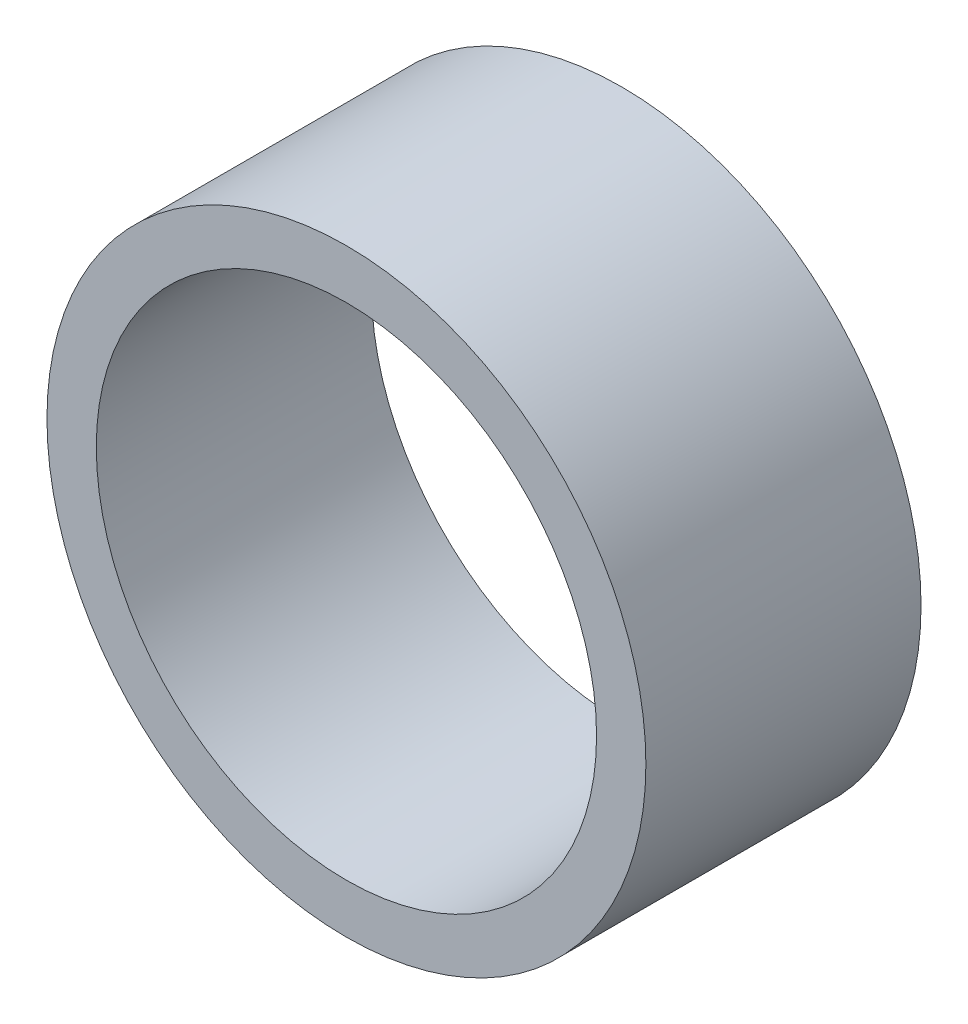
ISO-10303-21;
HEADER;
FILE_DESCRIPTION(('STEP AP214'),'2;1');
FILE_NAME('part.step','',(''),(''),'','','');
FILE_SCHEMA(('AUTOMOTIVE_DESIGN { 1 0 10303 214 1 1 1 1 }'));
ENDSEC;
DATA;
#1=APPLICATION_CONTEXT('core data for automotive mechanical design processes');
#2=APPLICATION_PROTOCOL_DEFINITION('international standard','automotive_design',2000,#1);
#3=PRODUCT_CONTEXT('',#1,'mechanical');
#4=PRODUCT('Part','Part','',(#3));
#5=PRODUCT_RELATED_PRODUCT_CATEGORY('part','',(#4));
#6=PRODUCT_DEFINITION_FORMATION('','',#4);
#7=PRODUCT_DEFINITION_CONTEXT('part definition',#1,'design');
#8=PRODUCT_DEFINITION('design','',#6,#7);
#9=PRODUCT_DEFINITION_SHAPE('','',#8);
#10=(LENGTH_UNIT() NAMED_UNIT(*) SI_UNIT(.MILLI.,.METRE.));
#11=(NAMED_UNIT(*) PLANE_ANGLE_UNIT() SI_UNIT($,.RADIAN.));
#12=(NAMED_UNIT(*) SI_UNIT($,.STERADIAN.) SOLID_ANGLE_UNIT());
#13=UNCERTAINTY_MEASURE_WITH_UNIT(LENGTH_MEASURE(1.E-05),#10,'distance_accuracy_value','');
#14=(GEOMETRIC_REPRESENTATION_CONTEXT(3) GLOBAL_UNCERTAINTY_ASSIGNED_CONTEXT((#13)) GLOBAL_UNIT_ASSIGNED_CONTEXT((#10,
#11,#12)) REPRESENTATION_CONTEXT('',''));
#15=CARTESIAN_POINT('',(0.,0.,0.));
#16=DIRECTION('',(0.,0.,1.));
#17=DIRECTION('',(1.,0.,0.));
#18=AXIS2_PLACEMENT_3D('',#15,#16,#17);
#19=CARTESIAN_POINT('',(0.,0.,9.9));
#20=DIRECTION('',(0.,0.,1.));
#21=DIRECTION('',(1.,0.,0.));
#22=AXIS2_PLACEMENT_3D('',#19,#20,#21);
#23=PLANE('',#22);
#24=CARTESIAN_POINT('',(0.,0.,9.9));
#25=DIRECTION('',(0.,0.,1.));
#26=DIRECTION('',(1.,0.,0.));
#27=AXIS2_PLACEMENT_3D('',#24,#25,#26);
#28=CIRCLE('',#27,10.775);
#29=CARTESIAN_POINT('',(-10.775,0.,9.9));
#30=VERTEX_POINT('',#29);
#31=EDGE_CURVE('E10',#30,#30,#28,.T.);
#32=ORIENTED_EDGE('',*,*,#31,.T.);
#33=EDGE_LOOP('',(#32));
#34=FACE_BOUND('',#33,.T.);
#35=CARTESIAN_POINT('',(0.,0.,9.9));
#36=DIRECTION('',(0.,0.,1.));
#37=DIRECTION('',(1.,0.,0.));
#38=AXIS2_PLACEMENT_3D('',#35,#36,#37);
#39=CIRCLE('',#38,9.);
#40=CARTESIAN_POINT('',(-9.,0.,9.9));
#41=VERTEX_POINT('',#40);
#42=EDGE_CURVE('E42',#41,#41,#39,.T.);
#43=ORIENTED_EDGE('',*,*,#42,.F.);
#44=EDGE_LOOP('',(#43));
#45=FACE_BOUND('',#44,.T.);
#46=ADVANCED_FACE('F31',(#34,#45),#23,.T.);
#47=CARTESIAN_POINT('',(0.,0.,0.));
#48=DIRECTION('',(0.,0.,1.));
#49=DIRECTION('',(1.,0.,0.));
#50=AXIS2_PLACEMENT_3D('',#47,#48,#49);
#51=PLANE('',#50);
#52=CARTESIAN_POINT('',(0.,0.,0.));
#53=DIRECTION('',(0.,0.,1.));
#54=DIRECTION('',(1.,0.,0.));
#55=AXIS2_PLACEMENT_3D('',#52,#53,#54);
#56=CIRCLE('',#55,10.775);
#57=CARTESIAN_POINT('',(-10.775,0.,0.));
#58=VERTEX_POINT('',#57);
#59=EDGE_CURVE('E38',#58,#58,#56,.T.);
#60=ORIENTED_EDGE('',*,*,#59,.F.);
#61=EDGE_LOOP('',(#60));
#62=FACE_BOUND('',#61,.T.);
#63=CARTESIAN_POINT('',(0.,0.,0.));
#64=DIRECTION('',(0.,0.,1.));
#65=DIRECTION('',(1.,0.,0.));
#66=AXIS2_PLACEMENT_3D('',#63,#64,#65);
#67=CIRCLE('',#66,9.);
#68=CARTESIAN_POINT('',(-9.,0.,0.));
#69=VERTEX_POINT('',#68);
#70=EDGE_CURVE('E46',#69,#69,#67,.T.);
#71=ORIENTED_EDGE('',*,*,#70,.T.);
#72=EDGE_LOOP('',(#71));
#73=FACE_BOUND('',#72,.T.);
#74=ADVANCED_FACE('F52',(#62,#73),#51,.F.);
#75=CARTESIAN_POINT('',(0.,0.,9.9));
#76=DIRECTION('',(0.,0.,-1.));
#77=DIRECTION('',(-1.,0.,0.));
#78=AXIS2_PLACEMENT_3D('',#75,#76,#77);
#79=CYLINDRICAL_SURFACE('',#78,10.775);
#80=CARTESIAN_POINT('',(-10.775,0.,9.9));
#81=CARTESIAN_POINT('',(-10.775,0.,9.796875));
#82=CARTESIAN_POINT('',(-10.775,0.,9.69375));
#83=CARTESIAN_POINT('',(-10.775,0.,9.4875));
#84=CARTESIAN_POINT('',(-10.775,0.,9.384375));
#85=CARTESIAN_POINT('',(-10.775,0.,9.178125));
#86=CARTESIAN_POINT('',(-10.775,0.,9.075));
#87=CARTESIAN_POINT('',(-10.775,0.,8.86875));
#88=CARTESIAN_POINT('',(-10.775,0.,8.765625));
#89=CARTESIAN_POINT('',(-10.775,0.,8.559375));
#90=CARTESIAN_POINT('',(-10.775,0.,8.45625));
#91=CARTESIAN_POINT('',(-10.775,0.,8.25));
#92=CARTESIAN_POINT('',(-10.775,0.,8.146875));
#93=CARTESIAN_POINT('',(-10.775,0.,7.940625));
#94=CARTESIAN_POINT('',(-10.775,0.,7.8375));
#95=CARTESIAN_POINT('',(-10.775,0.,7.63125));
#96=CARTESIAN_POINT('',(-10.775,0.,7.528125));
#97=CARTESIAN_POINT('',(-10.775,0.,7.321875));
#98=CARTESIAN_POINT('',(-10.775,0.,7.21875));
#99=CARTESIAN_POINT('',(-10.775,0.,7.0125));
#100=CARTESIAN_POINT('',(-10.775,0.,6.909375));
#101=CARTESIAN_POINT('',(-10.775,0.,6.703125));
#102=CARTESIAN_POINT('',(-10.775,0.,6.6));
#103=CARTESIAN_POINT('',(-10.775,0.,6.39375));
#104=CARTESIAN_POINT('',(-10.775,0.,6.290625));
#105=CARTESIAN_POINT('',(-10.775,0.,6.084375));
#106=CARTESIAN_POINT('',(-10.775,0.,5.98125));
#107=CARTESIAN_POINT('',(-10.775,0.,5.775));
#108=CARTESIAN_POINT('',(-10.775,0.,5.671875));
#109=CARTESIAN_POINT('',(-10.775,0.,5.465625));
#110=CARTESIAN_POINT('',(-10.775,0.,5.3625));
#111=CARTESIAN_POINT('',(-10.775,0.,5.15625));
#112=CARTESIAN_POINT('',(-10.775,0.,5.053125));
#113=CARTESIAN_POINT('',(-10.775,0.,4.846875));
#114=CARTESIAN_POINT('',(-10.775,0.,4.74375));
#115=CARTESIAN_POINT('',(-10.775,0.,4.5375));
#116=CARTESIAN_POINT('',(-10.775,0.,4.434375));
#117=CARTESIAN_POINT('',(-10.775,0.,4.228125));
#118=CARTESIAN_POINT('',(-10.775,0.,4.125));
#119=CARTESIAN_POINT('',(-10.775,0.,3.91875));
#120=CARTESIAN_POINT('',(-10.775,0.,3.815625));
#121=CARTESIAN_POINT('',(-10.775,0.,3.609375));
#122=CARTESIAN_POINT('',(-10.775,0.,3.50625));
#123=CARTESIAN_POINT('',(-10.775,0.,3.3));
#124=CARTESIAN_POINT('',(-10.775,0.,3.196875));
#125=CARTESIAN_POINT('',(-10.775,0.,2.990625));
#126=CARTESIAN_POINT('',(-10.775,0.,2.8875));
#127=CARTESIAN_POINT('',(-10.775,0.,2.68125));
#128=CARTESIAN_POINT('',(-10.775,0.,2.578125));
#129=CARTESIAN_POINT('',(-10.775,0.,2.371875));
#130=CARTESIAN_POINT('',(-10.775,0.,2.26875));
#131=CARTESIAN_POINT('',(-10.775,0.,2.0625));
#132=CARTESIAN_POINT('',(-10.775,0.,1.959375));
#133=CARTESIAN_POINT('',(-10.775,0.,1.753125));
#134=CARTESIAN_POINT('',(-10.775,0.,1.65));
#135=CARTESIAN_POINT('',(-10.775,0.,1.44375));
#136=CARTESIAN_POINT('',(-10.775,0.,1.340625));
#137=CARTESIAN_POINT('',(-10.775,0.,1.134375));
#138=CARTESIAN_POINT('',(-10.775,0.,1.03125));
#139=CARTESIAN_POINT('',(-10.775,0.,0.825));
#140=CARTESIAN_POINT('',(-10.775,0.,0.721875));
#141=CARTESIAN_POINT('',(-10.775,0.,0.515625));
#142=CARTESIAN_POINT('',(-10.775,0.,0.4125));
#143=CARTESIAN_POINT('',(-10.775,0.,0.20625));
#144=CARTESIAN_POINT('',(-10.775,0.,0.103125));
#145=CARTESIAN_POINT('',(-10.775,0.,0.));
#146=B_SPLINE_CURVE_WITH_KNOTS('',3,(#80,#81,#82,#83,#84,#85,#86,#87,#88,#89,#90,#91,#92,#93,
#94,#95,#96,#97,#98,#99,#100,#101,#102,#103,#104,#105,#106,#107,#108,#109,#110,#111,#112,#113,
#114,#115,#116,#117,#118,#119,#120,#121,#122,#123,#124,#125,#126,#127,#128,#129,#130,#131,#132,
#133,#134,#135,#136,#137,#138,#139,#140,#141,#142,#143,#144,#145),.UNSPECIFIED.,.F.,.F.,(4,2,2,
2,2,2,2,2,2,2,2,2,2,2,2,2,2,2,2,2,2,2,2,2,2,2,2,2,2,2,2,2,4),(0.,0.309374999999999,
0.618749999999999,0.928124999999998,1.2375,1.546875,1.85625,2.165625,2.475,2.784375,3.09375,
3.403125,3.7125,4.021875,4.33125,4.640625,4.95,5.259375,5.56875,5.878125,6.1875,6.496875,
6.80625,7.115625,7.425,7.734375,8.04375,8.353125,8.6625,8.971875,9.28125,9.590625,9.9),.UNSPECIFIED.);
#147=EDGE_CURVE('BSEAM33',#30,#58,#146,.T.);
#148=ORIENTED_EDGE('',*,*,#31,.F.);
#149=ORIENTED_EDGE('',*,*,#59,.T.);
#150=ORIENTED_EDGE('',*,*,#147,.T.);
#151=ORIENTED_EDGE('',*,*,#147,.F.);
#152=EDGE_LOOP('',(#148,#150,#149,#151));
#153=FACE_BOUND('',#152,.T.);
#154=ADVANCED_FACE('F33',(#153),#79,.T.);
#155=CARTESIAN_POINT('',(0.,0.,9.9));
#156=DIRECTION('',(0.,0.,-1.));
#157=DIRECTION('',(-1.,0.,0.));
#158=AXIS2_PLACEMENT_3D('',#155,#156,#157);
#159=CYLINDRICAL_SURFACE('',#158,9.);
#160=CARTESIAN_POINT('',(-9.,0.,9.9));
#161=CARTESIAN_POINT('',(-9.,0.,9.796875));
#162=CARTESIAN_POINT('',(-9.,0.,9.69375));
#163=CARTESIAN_POINT('',(-9.,0.,9.4875));
#164=CARTESIAN_POINT('',(-9.,0.,9.384375));
#165=CARTESIAN_POINT('',(-9.,0.,9.178125));
#166=CARTESIAN_POINT('',(-9.,0.,9.075));
#167=CARTESIAN_POINT('',(-9.,0.,8.86875));
#168=CARTESIAN_POINT('',(-9.,0.,8.765625));
#169=CARTESIAN_POINT('',(-9.,0.,8.559375));
#170=CARTESIAN_POINT('',(-9.,0.,8.45625));
#171=CARTESIAN_POINT('',(-9.,0.,8.25));
#172=CARTESIAN_POINT('',(-9.,0.,8.146875));
#173=CARTESIAN_POINT('',(-9.,0.,7.940625));
#174=CARTESIAN_POINT('',(-9.,0.,7.8375));
#175=CARTESIAN_POINT('',(-9.,0.,7.63125));
#176=CARTESIAN_POINT('',(-9.,0.,7.528125));
#177=CARTESIAN_POINT('',(-9.,0.,7.321875));
#178=CARTESIAN_POINT('',(-9.,0.,7.21875));
#179=CARTESIAN_POINT('',(-9.,0.,7.0125));
#180=CARTESIAN_POINT('',(-9.,0.,6.909375));
#181=CARTESIAN_POINT('',(-9.,0.,6.703125));
#182=CARTESIAN_POINT('',(-9.,0.,6.6));
#183=CARTESIAN_POINT('',(-9.,0.,6.39375));
#184=CARTESIAN_POINT('',(-9.,0.,6.290625));
#185=CARTESIAN_POINT('',(-9.,0.,6.084375));
#186=CARTESIAN_POINT('',(-9.,0.,5.98125));
#187=CARTESIAN_POINT('',(-9.,0.,5.775));
#188=CARTESIAN_POINT('',(-9.,0.,5.671875));
#189=CARTESIAN_POINT('',(-9.,0.,5.465625));
#190=CARTESIAN_POINT('',(-9.,0.,5.3625));
#191=CARTESIAN_POINT('',(-9.,0.,5.15625));
#192=CARTESIAN_POINT('',(-9.,0.,5.053125));
#193=CARTESIAN_POINT('',(-9.,0.,4.846875));
#194=CARTESIAN_POINT('',(-9.,0.,4.74375));
#195=CARTESIAN_POINT('',(-9.,0.,4.5375));
#196=CARTESIAN_POINT('',(-9.,0.,4.434375));
#197=CARTESIAN_POINT('',(-9.,0.,4.228125));
#198=CARTESIAN_POINT('',(-9.,0.,4.125));
#199=CARTESIAN_POINT('',(-9.,0.,3.91875));
#200=CARTESIAN_POINT('',(-9.,0.,3.815625));
#201=CARTESIAN_POINT('',(-9.,0.,3.609375));
#202=CARTESIAN_POINT('',(-9.,0.,3.50625));
#203=CARTESIAN_POINT('',(-9.,0.,3.3));
#204=CARTESIAN_POINT('',(-9.,0.,3.196875));
#205=CARTESIAN_POINT('',(-9.,0.,2.990625));
#206=CARTESIAN_POINT('',(-9.,0.,2.8875));
#207=CARTESIAN_POINT('',(-9.,0.,2.68125));
#208=CARTESIAN_POINT('',(-9.,0.,2.578125));
#209=CARTESIAN_POINT('',(-9.,0.,2.371875));
#210=CARTESIAN_POINT('',(-9.,0.,2.26875));
#211=CARTESIAN_POINT('',(-9.,0.,2.0625));
#212=CARTESIAN_POINT('',(-9.,0.,1.959375));
#213=CARTESIAN_POINT('',(-9.,0.,1.753125));
#214=CARTESIAN_POINT('',(-9.,0.,1.65));
#215=CARTESIAN_POINT('',(-9.,0.,1.44375));
#216=CARTESIAN_POINT('',(-9.,0.,1.340625));
#217=CARTESIAN_POINT('',(-9.,0.,1.134375));
#218=CARTESIAN_POINT('',(-9.,0.,1.03125));
#219=CARTESIAN_POINT('',(-9.,0.,0.825));
#220=CARTESIAN_POINT('',(-9.,0.,0.721875));
#221=CARTESIAN_POINT('',(-9.,0.,0.515625));
#222=CARTESIAN_POINT('',(-9.,0.,0.4125));
#223=CARTESIAN_POINT('',(-9.,0.,0.20625));
#224=CARTESIAN_POINT('',(-9.,0.,0.103125));
#225=CARTESIAN_POINT('',(-9.,0.,0.));
#226=B_SPLINE_CURVE_WITH_KNOTS('',3,(#160,#161,#162,#163,#164,#165,#166,#167,#168,#169,#170,
#171,#172,#173,#174,#175,#176,#177,#178,#179,#180,#181,#182,#183,#184,#185,#186,#187,#188,#189,
#190,#191,#192,#193,#194,#195,#196,#197,#198,#199,#200,#201,#202,#203,#204,#205,#206,#207,#208,
#209,#210,#211,#212,#213,#214,#215,#216,#217,#218,#219,#220,#221,#222,#223,#224,#225),
.UNSPECIFIED.,.F.,.F.,(4,2,2,2,2,2,2,2,2,2,2,2,2,2,2,2,2,2,2,2,2,2,2,2,2,2,2,2,2,2,2,2,4),(0.,
0.309374999999999,0.618749999999999,0.928124999999998,1.2375,1.546875,1.85625,2.165625,2.475,
2.784375,3.09375,3.403125,3.7125,4.021875,4.33125,4.640625,4.95,5.259375,5.56875,5.878125,
6.1875,6.496875,6.80625,7.115625,7.425,7.734375,8.04375,8.353125,8.6625,8.971875,9.28125,
9.590625,9.9),.UNSPECIFIED.);
#227=EDGE_CURVE('BSEAM54',#41,#69,#226,.T.);
#228=ORIENTED_EDGE('',*,*,#42,.T.);
#229=ORIENTED_EDGE('',*,*,#70,.F.);
#230=ORIENTED_EDGE('',*,*,#227,.T.);
#231=ORIENTED_EDGE('',*,*,#227,.F.);
#232=EDGE_LOOP('',(#228,#230,#229,#231));
#233=FACE_BOUND('',#232,.T.);
#234=ADVANCED_FACE('F54',(#233),#159,.F.);
#235=CLOSED_SHELL('',(#46,#74,#154,#234));
#236=MANIFOLD_SOLID_BREP('B2',#235);
#237=ADVANCED_BREP_SHAPE_REPRESENTATION('',(#18,#236),#14);
#238=SHAPE_DEFINITION_REPRESENTATION(#9,#237);
ENDSEC;
END-ISO-10303-21;
